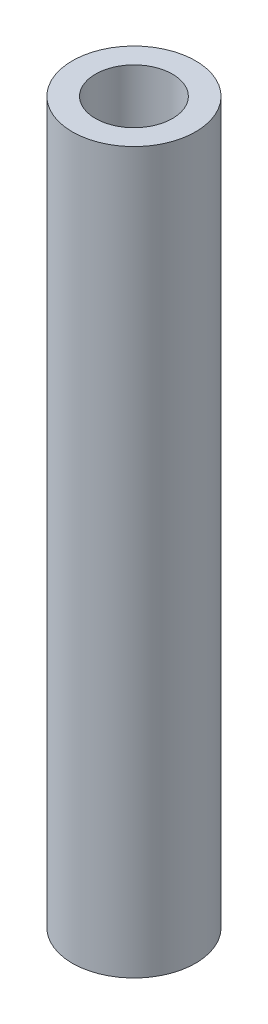
ISO-10303-21;
HEADER;
FILE_DESCRIPTION(('STEP AP214'),'2;1');
FILE_NAME('part.step','',(''),(''),'','','');
FILE_SCHEMA(('AUTOMOTIVE_DESIGN { 1 0 10303 214 1 1 1 1 }'));
ENDSEC;
DATA;
#1=APPLICATION_CONTEXT('core data for automotive mechanical design processes');
#2=APPLICATION_PROTOCOL_DEFINITION('international standard','automotive_design',2000,#1);
#3=PRODUCT_CONTEXT('',#1,'mechanical');
#4=PRODUCT('Part','Part','',(#3));
#5=PRODUCT_RELATED_PRODUCT_CATEGORY('part','',(#4));
#6=PRODUCT_DEFINITION_FORMATION('','',#4);
#7=PRODUCT_DEFINITION_CONTEXT('part definition',#1,'design');
#8=PRODUCT_DEFINITION('design','',#6,#7);
#9=PRODUCT_DEFINITION_SHAPE('','',#8);
#10=(LENGTH_UNIT() NAMED_UNIT(*) SI_UNIT(.MILLI.,.METRE.));
#11=(NAMED_UNIT(*) PLANE_ANGLE_UNIT() SI_UNIT($,.RADIAN.));
#12=(NAMED_UNIT(*) SI_UNIT($,.STERADIAN.) SOLID_ANGLE_UNIT());
#13=UNCERTAINTY_MEASURE_WITH_UNIT(LENGTH_MEASURE(1.E-05),#10,'distance_accuracy_value','');
#14=(GEOMETRIC_REPRESENTATION_CONTEXT(3) GLOBAL_UNCERTAINTY_ASSIGNED_CONTEXT((#13)) GLOBAL_UNIT_ASSIGNED_CONTEXT((#10,
#11,#12)) REPRESENTATION_CONTEXT('',''));
#15=CARTESIAN_POINT('',(0.,0.,0.));
#16=DIRECTION('',(0.,0.,1.));
#17=DIRECTION('',(1.,0.,0.));
#18=AXIS2_PLACEMENT_3D('',#15,#16,#17);
#19=CARTESIAN_POINT('',(0.,46.75,0.));
#20=DIRECTION('',(0.,1.,0.));
#21=DIRECTION('',(0.,0.,1.));
#22=AXIS2_PLACEMENT_3D('',#19,#20,#21);
#23=PLANE('',#22);
#24=CARTESIAN_POINT('',(0.,46.75,0.));
#25=DIRECTION('',(0.,1.,0.));
#26=DIRECTION('',(0.,0.,1.));
#27=AXIS2_PLACEMENT_3D('',#24,#25,#26);
#28=CIRCLE('',#27,4.);
#29=CARTESIAN_POINT('',(0.,46.75,4.));
#30=VERTEX_POINT('',#29);
#31=EDGE_CURVE('E10',#30,#30,#28,.T.);
#32=ORIENTED_EDGE('',*,*,#31,.T.);
#33=EDGE_LOOP('',(#32));
#34=FACE_BOUND('',#33,.T.);
#35=CARTESIAN_POINT('',(0.,46.75,0.));
#36=DIRECTION('',(0.,1.,0.));
#37=DIRECTION('',(0.,0.,1.));
#38=AXIS2_PLACEMENT_3D('',#35,#36,#37);
#39=CIRCLE('',#38,2.5);
#40=CARTESIAN_POINT('',(0.,46.75,2.5));
#41=VERTEX_POINT('',#40);
#42=EDGE_CURVE('E50',#41,#41,#39,.T.);
#43=ORIENTED_EDGE('',*,*,#42,.F.);
#44=EDGE_LOOP('',(#43));
#45=FACE_BOUND('',#44,.T.);
#46=ADVANCED_FACE('F37',(#34,#45),#23,.T.);
#47=CARTESIAN_POINT('',(0.,0.,0.));
#48=DIRECTION('',(0.,1.,0.));
#49=DIRECTION('',(0.,0.,1.));
#50=AXIS2_PLACEMENT_3D('',#47,#48,#49);
#51=PLANE('',#50);
#52=CARTESIAN_POINT('',(0.,0.,0.));
#53=DIRECTION('',(0.,1.,0.));
#54=DIRECTION('',(0.,0.,1.));
#55=AXIS2_PLACEMENT_3D('',#52,#53,#54);
#56=CIRCLE('',#55,4.);
#57=CARTESIAN_POINT('',(0.,0.,4.));
#58=VERTEX_POINT('',#57);
#59=EDGE_CURVE('E41',#58,#58,#56,.T.);
#60=ORIENTED_EDGE('',*,*,#59,.F.);
#61=EDGE_LOOP('',(#60));
#62=FACE_BOUND('',#61,.T.);
#63=CARTESIAN_POINT('',(0.,0.,0.));
#64=DIRECTION('',(0.,1.,0.));
#65=DIRECTION('',(0.,0.,1.));
#66=AXIS2_PLACEMENT_3D('',#63,#64,#65);
#67=CIRCLE('',#66,2.5);
#68=CARTESIAN_POINT('',(0.,0.,2.5));
#69=VERTEX_POINT('',#68);
#70=EDGE_CURVE('E52',#69,#69,#67,.T.);
#71=ORIENTED_EDGE('',*,*,#70,.T.);
#72=EDGE_LOOP('',(#71));
#73=FACE_BOUND('',#72,.T.);
#74=ADVANCED_FACE('F64',(#62,#73),#51,.F.);
#75=CARTESIAN_POINT('',(0.,46.75,0.));
#76=DIRECTION('',(0.,-1.,0.));
#77=DIRECTION('',(0.,0.,-1.));
#78=AXIS2_PLACEMENT_3D('',#75,#76,#77);
#79=CYLINDRICAL_SURFACE('',#78,4.);
#80=ORIENTED_EDGE('',*,*,#31,.F.);
#81=EDGE_LOOP('',(#80));
#82=FACE_BOUND('',#81,.T.);
#83=ORIENTED_EDGE('',*,*,#59,.T.);
#84=EDGE_LOOP('',(#83));
#85=FACE_BOUND('',#84,.T.);
#86=ADVANCED_FACE('F39',(#82,#85),#79,.T.);
#87=CARTESIAN_POINT('',(0.,46.75,0.));
#88=DIRECTION('',(0.,-1.,0.));
#89=DIRECTION('',(0.,0.,-1.));
#90=AXIS2_PLACEMENT_3D('',#87,#88,#89);
#91=CYLINDRICAL_SURFACE('',#90,2.5);
#92=ORIENTED_EDGE('',*,*,#42,.T.);
#93=EDGE_LOOP('',(#92));
#94=FACE_BOUND('',#93,.T.);
#95=ORIENTED_EDGE('',*,*,#70,.F.);
#96=EDGE_LOOP('',(#95));
#97=FACE_BOUND('',#96,.T.);
#98=ADVANCED_FACE('F60',(#94,#97),#91,.F.);
#99=CLOSED_SHELL('',(#46,#74,#86,#98));
#100=MANIFOLD_SOLID_BREP('B2',#99);
#101=ADVANCED_BREP_SHAPE_REPRESENTATION('',(#18,#100),#14);
#102=SHAPE_DEFINITION_REPRESENTATION(#9,#101);
ENDSEC;
END-ISO-10303-21;
